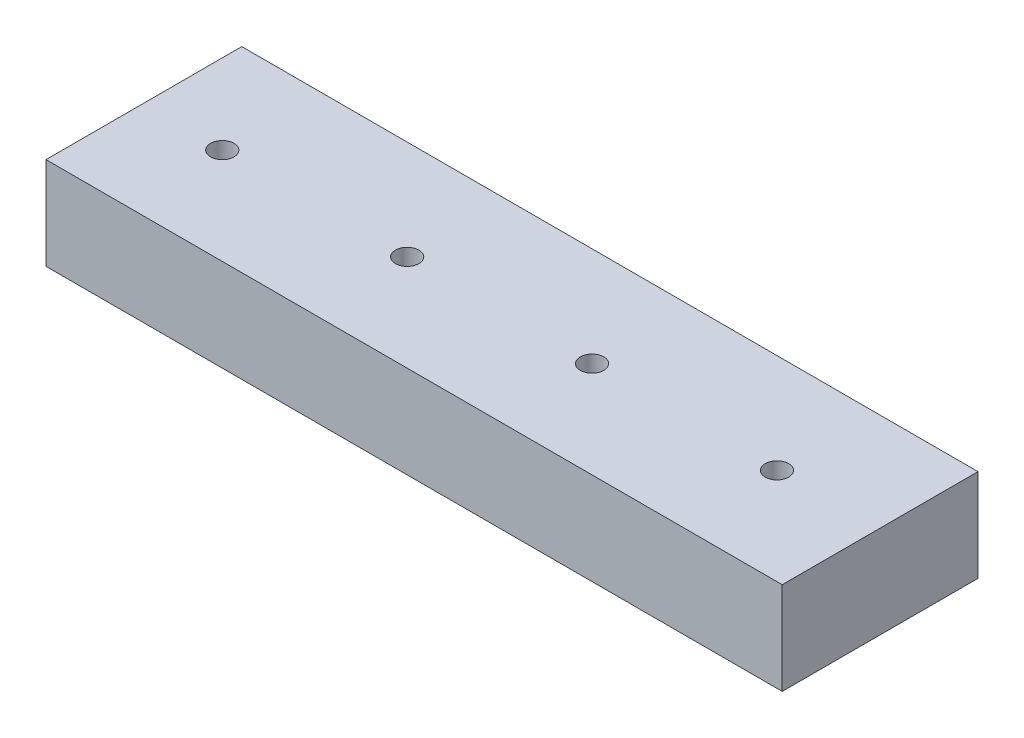
ISO-10303-21;
HEADER;
FILE_DESCRIPTION(('STEP AP214'),'2;1');
FILE_NAME('part.step','',(''),(''),'','','');
FILE_SCHEMA(('AUTOMOTIVE_DESIGN { 1 0 10303 214 1 1 1 1 }'));
ENDSEC;
DATA;
#1=APPLICATION_CONTEXT('core data for automotive mechanical design processes');
#2=APPLICATION_PROTOCOL_DEFINITION('international standard','automotive_design',2000,#1);
#3=PRODUCT_CONTEXT('',#1,'mechanical');
#4=PRODUCT('Part','Part','',(#3));
#5=PRODUCT_RELATED_PRODUCT_CATEGORY('part','',(#4));
#6=PRODUCT_DEFINITION_FORMATION('','',#4);
#7=PRODUCT_DEFINITION_CONTEXT('part definition',#1,'design');
#8=PRODUCT_DEFINITION('design','',#6,#7);
#9=PRODUCT_DEFINITION_SHAPE('','',#8);
#10=(LENGTH_UNIT() NAMED_UNIT(*) SI_UNIT(.MILLI.,.METRE.));
#11=(NAMED_UNIT(*) PLANE_ANGLE_UNIT() SI_UNIT($,.RADIAN.));
#12=(NAMED_UNIT(*) SI_UNIT($,.STERADIAN.) SOLID_ANGLE_UNIT());
#13=UNCERTAINTY_MEASURE_WITH_UNIT(LENGTH_MEASURE(1.E-05),#10,'distance_accuracy_value','');
#14=(GEOMETRIC_REPRESENTATION_CONTEXT(3) GLOBAL_UNCERTAINTY_ASSIGNED_CONTEXT((#13)) GLOBAL_UNIT_ASSIGNED_CONTEXT((#10,
#11,#12)) REPRESENTATION_CONTEXT('',''));
#15=CARTESIAN_POINT('',(0.,0.,0.));
#16=DIRECTION('',(0.,0.,1.));
#17=DIRECTION('',(1.,0.,0.));
#18=AXIS2_PLACEMENT_3D('',#15,#16,#17);
#19=CARTESIAN_POINT('',(50.9905818330272,10.,0.));
#20=DIRECTION('',(1.,0.,0.));
#21=DIRECTION('',(0.,0.,-1.));
#22=AXIS2_PLACEMENT_3D('',#19,#20,#21);
#23=PLANE('',#22);
#24=DIRECTION('',(0.,0.,1.));
#25=VECTOR('',#24,1.);
#26=CARTESIAN_POINT('',(50.9905818330272,0.,0.));
#27=LINE('',#26,#25);
#28=CARTESIAN_POINT('',(50.9905818330272,0.,-10.7542019430289));
#29=VERTEX_POINT('',#28);
#30=CARTESIAN_POINT('',(50.9905818330272,0.,10.424318447844));
#31=VERTEX_POINT('',#30);
#32=EDGE_CURVE('E161',#29,#31,#27,.T.);
#33=ORIENTED_EDGE('',*,*,#32,.F.);
#34=DIRECTION('',(0.,-1.,0.));
#35=VECTOR('',#34,1.);
#36=CARTESIAN_POINT('',(50.9905818330272,10.,-10.7542019430289));
#37=LINE('',#36,#35);
#38=CARTESIAN_POINT('',(50.9905818330272,10.,-10.7542019430289));
#39=VERTEX_POINT('',#38);
#40=EDGE_CURVE('E12',#39,#29,#37,.T.);
#41=ORIENTED_EDGE('',*,*,#40,.F.);
#42=DIRECTION('',(0.,0.,1.));
#43=VECTOR('',#42,1.);
#44=CARTESIAN_POINT('',(50.9905818330272,10.,0.));
#45=LINE('',#44,#43);
#46=CARTESIAN_POINT('',(50.9905818330272,10.,10.424318447844));
#47=VERTEX_POINT('',#46);
#48=EDGE_CURVE('E112',#39,#47,#45,.T.);
#49=ORIENTED_EDGE('',*,*,#48,.T.);
#50=DIRECTION('',(0.,-1.,0.));
#51=VECTOR('',#50,1.);
#52=CARTESIAN_POINT('',(50.9905818330272,10.,10.424318447844));
#53=LINE('',#52,#51);
#54=EDGE_CURVE('E89',#47,#31,#53,.T.);
#55=ORIENTED_EDGE('',*,*,#54,.T.);
#56=EDGE_LOOP('',(#33,#41,#49,#55));
#57=FACE_BOUND('',#56,.T.);
#58=ADVANCED_FACE('F48',(#57),#23,.T.);
#59=CARTESIAN_POINT('',(0.,10.,-10.7542019430289));
#60=DIRECTION('',(0.,0.,-1.));
#61=DIRECTION('',(-1.,0.,0.));
#62=AXIS2_PLACEMENT_3D('',#59,#60,#61);
#63=PLANE('',#62);
#64=DIRECTION('',(1.,0.,0.));
#65=VECTOR('',#64,1.);
#66=CARTESIAN_POINT('',(0.,0.,-10.7542019430289));
#67=LINE('',#66,#65);
#68=CARTESIAN_POINT('',(-28.6432939046161,0.,-10.7542019430289));
#69=VERTEX_POINT('',#68);
#70=EDGE_CURVE('E101',#69,#29,#67,.T.);
#71=ORIENTED_EDGE('',*,*,#70,.F.);
#72=DIRECTION('',(0.,-1.,0.));
#73=VECTOR('',#72,1.);
#74=CARTESIAN_POINT('',(-28.6432939046161,10.,-10.7542019430289));
#75=LINE('',#74,#73);
#76=CARTESIAN_POINT('',(-28.6432939046161,10.,-10.7542019430289));
#77=VERTEX_POINT('',#76);
#78=EDGE_CURVE('E58',#77,#69,#75,.T.);
#79=ORIENTED_EDGE('',*,*,#78,.F.);
#80=DIRECTION('',(1.,0.,0.));
#81=VECTOR('',#80,1.);
#82=CARTESIAN_POINT('',(0.,10.,-10.7542019430289));
#83=LINE('',#82,#81);
#84=EDGE_CURVE('E99',#77,#39,#83,.T.);
#85=ORIENTED_EDGE('',*,*,#84,.T.);
#86=ORIENTED_EDGE('',*,*,#40,.T.);
#87=EDGE_LOOP('',(#71,#79,#85,#86));
#88=FACE_BOUND('',#87,.T.);
#89=ADVANCED_FACE('F97',(#88),#63,.T.);
#90=CARTESIAN_POINT('',(-28.6432939046161,10.,0.));
#91=DIRECTION('',(1.,0.,0.));
#92=DIRECTION('',(0.,0.,-1.));
#93=AXIS2_PLACEMENT_3D('',#90,#91,#92);
#94=PLANE('',#93);
#95=DIRECTION('',(0.,0.,1.));
#96=VECTOR('',#95,1.);
#97=CARTESIAN_POINT('',(-28.6432939046161,0.,0.));
#98=LINE('',#97,#96);
#99=CARTESIAN_POINT('',(-28.6432939046161,0.,10.424318447844));
#100=VERTEX_POINT('',#99);
#101=EDGE_CURVE('E149',#69,#100,#98,.T.);
#102=ORIENTED_EDGE('',*,*,#101,.T.);
#103=DIRECTION('',(0.,-1.,0.));
#104=VECTOR('',#103,1.);
#105=CARTESIAN_POINT('',(-28.6432939046161,10.,10.424318447844));
#106=LINE('',#105,#104);
#107=CARTESIAN_POINT('',(-28.6432939046161,10.,10.424318447844));
#108=VERTEX_POINT('',#107);
#109=EDGE_CURVE('E105',#108,#100,#106,.T.);
#110=ORIENTED_EDGE('',*,*,#109,.F.);
#111=DIRECTION('',(0.,0.,1.));
#112=VECTOR('',#111,1.);
#113=CARTESIAN_POINT('',(-28.6432939046161,10.,0.));
#114=LINE('',#113,#112);
#115=EDGE_CURVE('E107',#77,#108,#114,.T.);
#116=ORIENTED_EDGE('',*,*,#115,.F.);
#117=ORIENTED_EDGE('',*,*,#78,.T.);
#118=EDGE_LOOP('',(#102,#110,#116,#117));
#119=FACE_BOUND('',#118,.T.);
#120=ADVANCED_FACE('F108',(#119),#94,.F.);
#121=CARTESIAN_POINT('',(-20.,10.,0.));
#122=DIRECTION('',(0.,-1.,0.));
#123=DIRECTION('',(0.,0.,-1.));
#124=AXIS2_PLACEMENT_3D('',#121,#122,#123);
#125=CYLINDRICAL_SURFACE('',#124,1.27);
#126=CARTESIAN_POINT('',(-20.,10.,0.));
#127=DIRECTION('',(0.,1.,0.));
#128=DIRECTION('',(0.,0.,1.));
#129=AXIS2_PLACEMENT_3D('',#126,#127,#128);
#130=CIRCLE('',#129,1.27);
#131=CARTESIAN_POINT('',(-20.,10.,1.27));
#132=VERTEX_POINT('',#131);
#133=EDGE_CURVE('E116',#132,#132,#130,.T.);
#134=ORIENTED_EDGE('',*,*,#133,.T.);
#135=EDGE_LOOP('',(#134));
#136=FACE_BOUND('',#135,.T.);
#137=CARTESIAN_POINT('',(-20.,0.,0.));
#138=DIRECTION('',(0.,1.,0.));
#139=DIRECTION('',(0.,0.,1.));
#140=AXIS2_PLACEMENT_3D('',#137,#138,#139);
#141=CIRCLE('',#140,1.27);
#142=CARTESIAN_POINT('',(-20.,0.,1.27));
#143=VERTEX_POINT('',#142);
#144=EDGE_CURVE('E164',#143,#143,#141,.T.);
#145=ORIENTED_EDGE('',*,*,#144,.F.);
#146=EDGE_LOOP('',(#145));
#147=FACE_BOUND('',#146,.T.);
#148=ADVANCED_FACE('F204',(#136,#147),#125,.F.);
#149=CARTESIAN_POINT('',(0.,10.,0.));
#150=DIRECTION('',(0.,-1.,0.));
#151=DIRECTION('',(0.,0.,-1.));
#152=AXIS2_PLACEMENT_3D('',#149,#150,#151);
#153=CYLINDRICAL_SURFACE('',#152,1.27);
#154=CARTESIAN_POINT('',(0.,10.,0.));
#155=DIRECTION('',(0.,1.,0.));
#156=DIRECTION('',(0.,0.,1.));
#157=AXIS2_PLACEMENT_3D('',#154,#155,#156);
#158=CIRCLE('',#157,1.27);
#159=CARTESIAN_POINT('',(0.,10.,1.27));
#160=VERTEX_POINT('',#159);
#161=EDGE_CURVE('E131',#160,#160,#158,.T.);
#162=ORIENTED_EDGE('',*,*,#161,.T.);
#163=EDGE_LOOP('',(#162));
#164=FACE_BOUND('',#163,.T.);
#165=CARTESIAN_POINT('',(0.,0.,0.));
#166=DIRECTION('',(0.,1.,0.));
#167=DIRECTION('',(0.,0.,1.));
#168=AXIS2_PLACEMENT_3D('',#165,#166,#167);
#169=CIRCLE('',#168,1.27);
#170=CARTESIAN_POINT('',(0.,0.,1.27));
#171=VERTEX_POINT('',#170);
#172=EDGE_CURVE('E170',#171,#171,#169,.T.);
#173=ORIENTED_EDGE('',*,*,#172,.F.);
#174=EDGE_LOOP('',(#173));
#175=FACE_BOUND('',#174,.T.);
#176=ADVANCED_FACE('F194',(#164,#175),#153,.F.);
#177=CARTESIAN_POINT('',(20.,10.,0.));
#178=DIRECTION('',(0.,-1.,0.));
#179=DIRECTION('',(0.,0.,-1.));
#180=AXIS2_PLACEMENT_3D('',#177,#178,#179);
#181=CYLINDRICAL_SURFACE('',#180,1.27);
#182=CARTESIAN_POINT('',(20.,10.,0.));
#183=DIRECTION('',(0.,1.,0.));
#184=DIRECTION('',(0.,0.,1.));
#185=AXIS2_PLACEMENT_3D('',#182,#183,#184);
#186=CIRCLE('',#185,1.27);
#187=CARTESIAN_POINT('',(20.,10.,1.27));
#188=VERTEX_POINT('',#187);
#189=EDGE_CURVE('E136',#188,#188,#186,.T.);
#190=ORIENTED_EDGE('',*,*,#189,.T.);
#191=EDGE_LOOP('',(#190));
#192=FACE_BOUND('',#191,.T.);
#193=CARTESIAN_POINT('',(20.,0.,0.));
#194=DIRECTION('',(0.,1.,0.));
#195=DIRECTION('',(0.,0.,1.));
#196=AXIS2_PLACEMENT_3D('',#193,#194,#195);
#197=CIRCLE('',#196,1.27);
#198=CARTESIAN_POINT('',(20.,0.,1.27));
#199=VERTEX_POINT('',#198);
#200=EDGE_CURVE('E174',#199,#199,#197,.T.);
#201=ORIENTED_EDGE('',*,*,#200,.F.);
#202=EDGE_LOOP('',(#201));
#203=FACE_BOUND('',#202,.T.);
#204=ADVANCED_FACE('F188',(#192,#203),#181,.F.);
#205=CARTESIAN_POINT('',(40.,10.,0.));
#206=DIRECTION('',(0.,-1.,0.));
#207=DIRECTION('',(0.,0.,-1.));
#208=AXIS2_PLACEMENT_3D('',#205,#206,#207);
#209=CYLINDRICAL_SURFACE('',#208,1.27);
#210=CARTESIAN_POINT('',(40.,10.,0.));
#211=DIRECTION('',(0.,1.,0.));
#212=DIRECTION('',(0.,0.,1.));
#213=AXIS2_PLACEMENT_3D('',#210,#211,#212);
#214=CIRCLE('',#213,1.27);
#215=CARTESIAN_POINT('',(40.,10.,1.27));
#216=VERTEX_POINT('',#215);
#217=EDGE_CURVE('E141',#216,#216,#214,.T.);
#218=ORIENTED_EDGE('',*,*,#217,.T.);
#219=EDGE_LOOP('',(#218));
#220=FACE_BOUND('',#219,.T.);
#221=CARTESIAN_POINT('',(40.,0.,0.));
#222=DIRECTION('',(0.,1.,0.));
#223=DIRECTION('',(0.,0.,1.));
#224=AXIS2_PLACEMENT_3D('',#221,#222,#223);
#225=CIRCLE('',#224,1.27);
#226=CARTESIAN_POINT('',(40.,0.,1.27));
#227=VERTEX_POINT('',#226);
#228=EDGE_CURVE('E178',#227,#227,#225,.T.);
#229=ORIENTED_EDGE('',*,*,#228,.F.);
#230=EDGE_LOOP('',(#229));
#231=FACE_BOUND('',#230,.T.);
#232=ADVANCED_FACE('F50',(#220,#231),#209,.F.);
#233=CARTESIAN_POINT('',(0.,10.,10.424318447844));
#234=DIRECTION('',(0.,0.,-1.));
#235=DIRECTION('',(-1.,0.,0.));
#236=AXIS2_PLACEMENT_3D('',#233,#234,#235);
#237=PLANE('',#236);
#238=DIRECTION('',(1.,0.,0.));
#239=VECTOR('',#238,1.);
#240=CARTESIAN_POINT('',(0.,0.,10.424318447844));
#241=LINE('',#240,#239);
#242=EDGE_CURVE('E82',#100,#31,#241,.T.);
#243=ORIENTED_EDGE('',*,*,#242,.T.);
#244=ORIENTED_EDGE('',*,*,#54,.F.);
#245=DIRECTION('',(1.,0.,0.));
#246=VECTOR('',#245,1.);
#247=CARTESIAN_POINT('',(0.,10.,10.424318447844));
#248=LINE('',#247,#246);
#249=EDGE_CURVE('E66',#108,#47,#248,.T.);
#250=ORIENTED_EDGE('',*,*,#249,.F.);
#251=ORIENTED_EDGE('',*,*,#109,.T.);
#252=EDGE_LOOP('',(#243,#244,#250,#251));
#253=FACE_BOUND('',#252,.T.);
#254=ADVANCED_FACE('F159',(#253),#237,.F.);
#255=CARTESIAN_POINT('',(0.,10.,0.));
#256=DIRECTION('',(0.,1.,0.));
#257=DIRECTION('',(0.,0.,1.));
#258=AXIS2_PLACEMENT_3D('',#255,#256,#257);
#259=PLANE('',#258);
#260=ORIENTED_EDGE('',*,*,#217,.F.);
#261=EDGE_LOOP('',(#260));
#262=FACE_BOUND('',#261,.T.);
#263=ORIENTED_EDGE('',*,*,#189,.F.);
#264=EDGE_LOOP('',(#263));
#265=FACE_BOUND('',#264,.T.);
#266=ORIENTED_EDGE('',*,*,#161,.F.);
#267=EDGE_LOOP('',(#266));
#268=FACE_BOUND('',#267,.T.);
#269=ORIENTED_EDGE('',*,*,#133,.F.);
#270=EDGE_LOOP('',(#269));
#271=FACE_BOUND('',#270,.T.);
#272=ORIENTED_EDGE('',*,*,#48,.F.);
#273=ORIENTED_EDGE('',*,*,#84,.F.);
#274=ORIENTED_EDGE('',*,*,#115,.T.);
#275=ORIENTED_EDGE('',*,*,#249,.T.);
#276=EDGE_LOOP('',(#272,#273,#274,#275));
#277=FACE_BOUND('',#276,.T.);
#278=ADVANCED_FACE('F111',(#262,#265,#268,#271,#277),#259,.T.);
#279=CARTESIAN_POINT('',(0.,0.,0.));
#280=DIRECTION('',(0.,1.,0.));
#281=DIRECTION('',(0.,0.,1.));
#282=AXIS2_PLACEMENT_3D('',#279,#280,#281);
#283=PLANE('',#282);
#284=ORIENTED_EDGE('',*,*,#228,.T.);
#285=EDGE_LOOP('',(#284));
#286=FACE_BOUND('',#285,.T.);
#287=ORIENTED_EDGE('',*,*,#200,.T.);
#288=EDGE_LOOP('',(#287));
#289=FACE_BOUND('',#288,.T.);
#290=ORIENTED_EDGE('',*,*,#172,.T.);
#291=EDGE_LOOP('',(#290));
#292=FACE_BOUND('',#291,.T.);
#293=ORIENTED_EDGE('',*,*,#144,.T.);
#294=EDGE_LOOP('',(#293));
#295=FACE_BOUND('',#294,.T.);
#296=ORIENTED_EDGE('',*,*,#32,.T.);
#297=ORIENTED_EDGE('',*,*,#242,.F.);
#298=ORIENTED_EDGE('',*,*,#101,.F.);
#299=ORIENTED_EDGE('',*,*,#70,.T.);
#300=EDGE_LOOP('',(#296,#297,#298,#299));
#301=FACE_BOUND('',#300,.T.);
#302=ADVANCED_FACE('F160',(#286,#289,#292,#295,#301),#283,.F.);
#303=CLOSED_SHELL('',(#58,#89,#120,#148,#176,#204,#232,#254,#278,#302));
#304=MANIFOLD_SOLID_BREP('B2',#303);
#305=ADVANCED_BREP_SHAPE_REPRESENTATION('',(#18,#304),#14);
#306=SHAPE_DEFINITION_REPRESENTATION(#9,#305);
ENDSEC;
END-ISO-10303-21;
